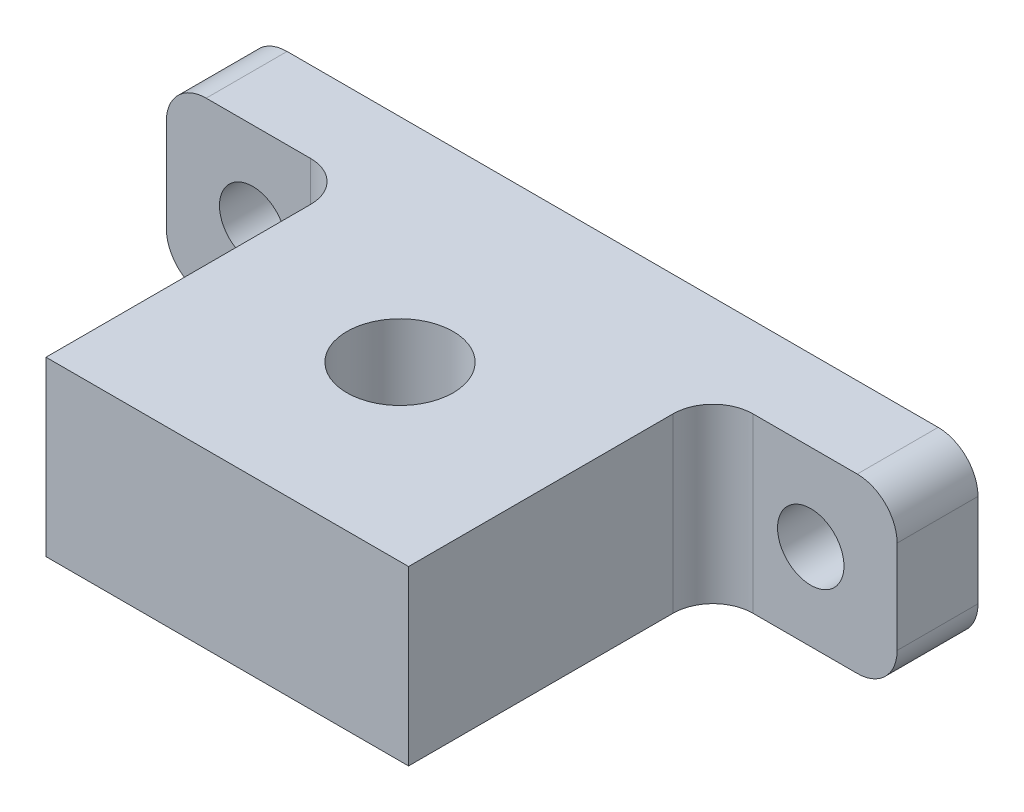
ISO-10303-21;
HEADER;
FILE_DESCRIPTION(('STEP AP214'),'2;1');
FILE_NAME('part.step','',(''),(''),'','','');
FILE_SCHEMA(('AUTOMOTIVE_DESIGN { 1 0 10303 214 1 1 1 1 }'));
ENDSEC;
DATA;
#1=APPLICATION_CONTEXT('core data for automotive mechanical design processes');
#2=APPLICATION_PROTOCOL_DEFINITION('international standard','automotive_design',2000,#1);
#3=PRODUCT_CONTEXT('',#1,'mechanical');
#4=PRODUCT('Part','Part','',(#3));
#5=PRODUCT_RELATED_PRODUCT_CATEGORY('part','',(#4));
#6=PRODUCT_DEFINITION_FORMATION('','',#4);
#7=PRODUCT_DEFINITION_CONTEXT('part definition',#1,'design');
#8=PRODUCT_DEFINITION('design','',#6,#7);
#9=PRODUCT_DEFINITION_SHAPE('','',#8);
#10=(LENGTH_UNIT() NAMED_UNIT(*) SI_UNIT(.MILLI.,.METRE.));
#11=(NAMED_UNIT(*) PLANE_ANGLE_UNIT() SI_UNIT($,.RADIAN.));
#12=(NAMED_UNIT(*) SI_UNIT($,.STERADIAN.) SOLID_ANGLE_UNIT());
#13=UNCERTAINTY_MEASURE_WITH_UNIT(LENGTH_MEASURE(1.E-05),#10,'distance_accuracy_value','');
#14=(GEOMETRIC_REPRESENTATION_CONTEXT(3) GLOBAL_UNCERTAINTY_ASSIGNED_CONTEXT((#13)) GLOBAL_UNIT_ASSIGNED_CONTEXT((#10,
#11,#12)) REPRESENTATION_CONTEXT('',''));
#15=CARTESIAN_POINT('',(0.,0.,0.));
#16=DIRECTION('',(0.,0.,1.));
#17=DIRECTION('',(1.,0.,0.));
#18=AXIS2_PLACEMENT_3D('',#15,#16,#17);
#19=CARTESIAN_POINT('',(24.5,3.5,29.));
#20=DIRECTION('',(0.,0.,-1.));
#21=DIRECTION('',(-1.,0.,0.));
#22=AXIS2_PLACEMENT_3D('',#19,#20,#21);
#23=PLANE('',#22);
#24=DIRECTION('',(-1.,0.,0.));
#25=VECTOR('',#24,1.);
#26=CARTESIAN_POINT('',(-24.5,6.5,29.));
#27=LINE('',#26,#25);
#28=CARTESIAN_POINT('',(13.643156347869,6.5,29.));
#29=VERTEX_POINT('',#28);
#30=CARTESIAN_POINT('',(-13.643156347869,6.5,29.));
#31=VERTEX_POINT('',#30);
#32=EDGE_CURVE('E219',#29,#31,#27,.T.);
#33=ORIENTED_EDGE('',*,*,#32,.T.);
#34=DIRECTION('',(0.,-1.,0.));
#35=VECTOR('',#34,1.);
#36=CARTESIAN_POINT('',(-13.643156347869,6.5,29.));
#37=LINE('',#36,#35);
#38=CARTESIAN_POINT('',(-13.643156347869,-6.5,29.));
#39=VERTEX_POINT('',#38);
#40=EDGE_CURVE('E169',#31,#39,#37,.T.);
#41=ORIENTED_EDGE('',*,*,#40,.T.);
#42=DIRECTION('',(1.,0.,0.));
#43=VECTOR('',#42,1.);
#44=CARTESIAN_POINT('',(-24.5,-6.5,29.));
#45=LINE('',#44,#43);
#46=CARTESIAN_POINT('',(13.643156347869,-6.5,29.));
#47=VERTEX_POINT('',#46);
#48=EDGE_CURVE('E222',#39,#47,#45,.T.);
#49=ORIENTED_EDGE('',*,*,#48,.T.);
#50=DIRECTION('',(0.,-1.,0.));
#51=VECTOR('',#50,1.);
#52=CARTESIAN_POINT('',(13.643156347869,6.5,29.));
#53=LINE('',#52,#51);
#54=EDGE_CURVE('E185',#29,#47,#53,.T.);
#55=ORIENTED_EDGE('',*,*,#54,.F.);
#56=EDGE_LOOP('',(#33,#41,#49,#55));
#57=FACE_BOUND('',#56,.T.);
#58=ADVANCED_FACE('F36',(#57),#23,.F.);
#59=CARTESIAN_POINT('',(24.5,3.5,0.));
#60=DIRECTION('',(0.,0.,-1.));
#61=DIRECTION('',(-1.,0.,0.));
#62=AXIS2_PLACEMENT_3D('',#59,#60,#61);
#63=PLANE('',#62);
#64=CARTESIAN_POINT('',(-21.,0.,0.));
#65=DIRECTION('',(0.,0.,1.));
#66=DIRECTION('',(1.,0.,0.));
#67=AXIS2_PLACEMENT_3D('',#64,#65,#66);
#68=CIRCLE('',#67,2.5);
#69=CARTESIAN_POINT('',(-23.5,0.,0.));
#70=VERTEX_POINT('',#69);
#71=EDGE_CURVE('E215',#70,#70,#68,.T.);
#72=ORIENTED_EDGE('',*,*,#71,.T.);
#73=EDGE_LOOP('',(#72));
#74=FACE_BOUND('',#73,.T.);
#75=CARTESIAN_POINT('',(24.5,3.5,0.));
#76=DIRECTION('',(0.,0.,1.));
#77=DIRECTION('',(-1.,0.,0.));
#78=AXIS2_PLACEMENT_3D('',#75,#76,#77);
#79=CIRCLE('',#78,3.);
#80=CARTESIAN_POINT('',(27.5,3.49999999999998,0.));
#81=VERTEX_POINT('',#80);
#82=CARTESIAN_POINT('',(24.5,6.5,0.));
#83=VERTEX_POINT('',#82);
#84=EDGE_CURVE('E218',#81,#83,#79,.T.);
#85=ORIENTED_EDGE('',*,*,#84,.F.);
#86=DIRECTION('',(0.,1.,0.));
#87=VECTOR('',#86,1.);
#88=CARTESIAN_POINT('',(27.5,-3.49999999999998,0.));
#89=LINE('',#88,#87);
#90=CARTESIAN_POINT('',(27.5,-3.5,0.));
#91=VERTEX_POINT('',#90);
#92=EDGE_CURVE('E223',#91,#81,#89,.T.);
#93=ORIENTED_EDGE('',*,*,#92,.F.);
#94=CARTESIAN_POINT('',(24.5,-3.5,0.));
#95=DIRECTION('',(0.,0.,1.));
#96=DIRECTION('',(1.,0.,0.));
#97=AXIS2_PLACEMENT_3D('',#94,#95,#96);
#98=CIRCLE('',#97,3.);
#99=CARTESIAN_POINT('',(24.5,-6.5,0.));
#100=VERTEX_POINT('',#99);
#101=EDGE_CURVE('E243',#100,#91,#98,.T.);
#102=ORIENTED_EDGE('',*,*,#101,.F.);
#103=DIRECTION('',(1.,0.,0.));
#104=VECTOR('',#103,1.);
#105=CARTESIAN_POINT('',(-24.5,-6.5,0.));
#106=LINE('',#105,#104);
#107=CARTESIAN_POINT('',(-24.5,-6.5,0.));
#108=VERTEX_POINT('',#107);
#109=EDGE_CURVE('E240',#108,#100,#106,.T.);
#110=ORIENTED_EDGE('',*,*,#109,.F.);
#111=CARTESIAN_POINT('',(-24.5,-3.5,0.));
#112=DIRECTION('',(0.,0.,1.));
#113=DIRECTION('',(-1.,0.,0.));
#114=AXIS2_PLACEMENT_3D('',#111,#112,#113);
#115=CIRCLE('',#114,3.);
#116=CARTESIAN_POINT('',(-27.5,-3.49999999999998,0.));
#117=VERTEX_POINT('',#116);
#118=EDGE_CURVE('E237',#117,#108,#115,.T.);
#119=ORIENTED_EDGE('',*,*,#118,.F.);
#120=DIRECTION('',(0.,-1.,0.));
#121=VECTOR('',#120,1.);
#122=CARTESIAN_POINT('',(-27.5,-3.49999999999998,0.));
#123=LINE('',#122,#121);
#124=CARTESIAN_POINT('',(-27.5,3.49999999999998,0.));
#125=VERTEX_POINT('',#124);
#126=EDGE_CURVE('E234',#125,#117,#123,.T.);
#127=ORIENTED_EDGE('',*,*,#126,.F.);
#128=CARTESIAN_POINT('',(-24.5,3.5,0.));
#129=DIRECTION('',(0.,0.,1.));
#130=DIRECTION('',(-1.,0.,0.));
#131=AXIS2_PLACEMENT_3D('',#128,#129,#130);
#132=CIRCLE('',#131,3.);
#133=CARTESIAN_POINT('',(-24.5,6.5,0.));
#134=VERTEX_POINT('',#133);
#135=EDGE_CURVE('E231',#134,#125,#132,.T.);
#136=ORIENTED_EDGE('',*,*,#135,.F.);
#137=DIRECTION('',(-1.,0.,0.));
#138=VECTOR('',#137,1.);
#139=CARTESIAN_POINT('',(-24.5,6.5,0.));
#140=LINE('',#139,#138);
#141=EDGE_CURVE('E229',#83,#134,#140,.T.);
#142=ORIENTED_EDGE('',*,*,#141,.F.);
#143=EDGE_LOOP('',(#85,#93,#102,#110,#119,#127,#136,#142));
#144=FACE_BOUND('',#143,.T.);
#145=CARTESIAN_POINT('',(21.,0.,0.));
#146=DIRECTION('',(0.,0.,1.));
#147=DIRECTION('',(-1.,0.,0.));
#148=AXIS2_PLACEMENT_3D('',#145,#146,#147);
#149=CIRCLE('',#148,2.5);
#150=CARTESIAN_POINT('',(18.5,0.,0.));
#151=VERTEX_POINT('',#150);
#152=EDGE_CURVE('E212',#151,#151,#149,.T.);
#153=ORIENTED_EDGE('',*,*,#152,.T.);
#154=EDGE_LOOP('',(#153));
#155=FACE_BOUND('',#154,.T.);
#156=ADVANCED_FACE('F271',(#74,#144,#155),#63,.T.);
#157=CARTESIAN_POINT('',(24.5,3.5,29.));
#158=DIRECTION('',(0.,0.,-1.));
#159=DIRECTION('',(-1.,0.,0.));
#160=AXIS2_PLACEMENT_3D('',#157,#158,#159);
#161=CYLINDRICAL_SURFACE('',#160,3.);
#162=DIRECTION('',(0.,0.,-1.));
#163=VECTOR('',#162,1.);
#164=CARTESIAN_POINT('',(24.5,6.5,29.));
#165=LINE('',#164,#163);
#166=CARTESIAN_POINT('',(24.5,6.5,6.08705538521432));
#167=VERTEX_POINT('',#166);
#168=EDGE_CURVE('E11',#167,#83,#165,.T.);
#169=ORIENTED_EDGE('',*,*,#168,.F.);
#170=CARTESIAN_POINT('',(24.5,3.5,6.08705538521432));
#171=DIRECTION('',(0.,0.,-1.));
#172=DIRECTION('',(-1.,0.,0.));
#173=AXIS2_PLACEMENT_3D('',#170,#171,#172);
#174=CIRCLE('',#173,3.);
#175=CARTESIAN_POINT('',(27.5,3.49999999999998,6.08705538521432));
#176=VERTEX_POINT('',#175);
#177=EDGE_CURVE('E206',#167,#176,#174,.T.);
#178=ORIENTED_EDGE('',*,*,#177,.T.);
#179=DIRECTION('',(0.,0.,-1.));
#180=VECTOR('',#179,1.);
#181=CARTESIAN_POINT('',(27.5,3.49999999999998,29.));
#182=LINE('',#181,#180);
#183=EDGE_CURVE('E226',#176,#81,#182,.T.);
#184=ORIENTED_EDGE('',*,*,#183,.T.);
#185=ORIENTED_EDGE('',*,*,#84,.T.);
#186=EDGE_LOOP('',(#169,#178,#184,#185));
#187=FACE_BOUND('',#186,.T.);
#188=ADVANCED_FACE('F38',(#187),#161,.T.);
#189=CARTESIAN_POINT('',(-24.5,6.5,29.));
#190=DIRECTION('',(0.,-1.,0.));
#191=DIRECTION('',(1.,0.,0.));
#192=AXIS2_PLACEMENT_3D('',#189,#190,#191);
#193=PLANE('',#192);
#194=CARTESIAN_POINT('',(0.,6.5,16.));
#195=DIRECTION('',(0.,-1.,0.));
#196=DIRECTION('',(1.,0.,0.));
#197=AXIS2_PLACEMENT_3D('',#194,#195,#196);
#198=CIRCLE('',#197,4.);
#199=CARTESIAN_POINT('',(4.,6.5,16.));
#200=VERTEX_POINT('',#199);
#201=EDGE_CURVE('E190',#200,#200,#198,.T.);
#202=ORIENTED_EDGE('',*,*,#201,.T.);
#203=EDGE_LOOP('',(#202));
#204=FACE_BOUND('',#203,.T.);
#205=CARTESIAN_POINT('',(-16.643156347869,6.5,9.08705538521433));
#206=DIRECTION('',(0.,-1.,0.));
#207=DIRECTION('',(1.,0.,0.));
#208=AXIS2_PLACEMENT_3D('',#205,#206,#207);
#209=CIRCLE('',#208,3.);
#210=CARTESIAN_POINT('',(-16.643156347869,6.5,6.08705538521433));
#211=VERTEX_POINT('',#210);
#212=CARTESIAN_POINT('',(-13.643156347869,6.5,9.08705538521435));
#213=VERTEX_POINT('',#212);
#214=EDGE_CURVE('E150',#211,#213,#209,.T.);
#215=ORIENTED_EDGE('',*,*,#214,.T.);
#216=DIRECTION('',(0.,0.,1.));
#217=VECTOR('',#216,1.);
#218=CARTESIAN_POINT('',(-13.643156347869,6.5,29.));
#219=LINE('',#218,#217);
#220=EDGE_CURVE('E155',#213,#31,#219,.T.);
#221=ORIENTED_EDGE('',*,*,#220,.T.);
#222=ORIENTED_EDGE('',*,*,#32,.F.);
#223=DIRECTION('',(0.,0.,-1.));
#224=VECTOR('',#223,1.);
#225=CARTESIAN_POINT('',(13.643156347869,6.5,29.));
#226=LINE('',#225,#224);
#227=CARTESIAN_POINT('',(13.643156347869,6.5,9.08705538521432));
#228=VERTEX_POINT('',#227);
#229=EDGE_CURVE('E175',#29,#228,#226,.T.);
#230=ORIENTED_EDGE('',*,*,#229,.T.);
#231=CARTESIAN_POINT('',(16.643156347869,6.5,9.08705538521432));
#232=DIRECTION('',(0.,-1.,0.));
#233=DIRECTION('',(-1.,0.,0.));
#234=AXIS2_PLACEMENT_3D('',#231,#232,#233);
#235=CIRCLE('',#234,3.);
#236=CARTESIAN_POINT('',(16.643156347869,6.5,6.08705538521432));
#237=VERTEX_POINT('',#236);
#238=EDGE_CURVE('E178',#228,#237,#235,.T.);
#239=ORIENTED_EDGE('',*,*,#238,.T.);
#240=DIRECTION('',(1.,0.,0.));
#241=VECTOR('',#240,1.);
#242=CARTESIAN_POINT('',(27.5,6.5,6.08705538521432));
#243=LINE('',#242,#241);
#244=EDGE_CURVE('E182',#237,#167,#243,.T.);
#245=ORIENTED_EDGE('',*,*,#244,.T.);
#246=ORIENTED_EDGE('',*,*,#168,.T.);
#247=ORIENTED_EDGE('',*,*,#141,.T.);
#248=DIRECTION('',(0.,0.,-1.));
#249=VECTOR('',#248,1.);
#250=CARTESIAN_POINT('',(-24.5,6.5,29.));
#251=LINE('',#250,#249);
#252=CARTESIAN_POINT('',(-24.5,6.5,6.08705538521433));
#253=VERTEX_POINT('',#252);
#254=EDGE_CURVE('E45',#253,#134,#251,.T.);
#255=ORIENTED_EDGE('',*,*,#254,.F.);
#256=DIRECTION('',(1.,0.,0.));
#257=VECTOR('',#256,1.);
#258=CARTESIAN_POINT('',(-27.5,6.5,6.08705538521433));
#259=LINE('',#258,#257);
#260=EDGE_CURVE('E140',#253,#211,#259,.T.);
#261=ORIENTED_EDGE('',*,*,#260,.T.);
#262=EDGE_LOOP('',(#215,#221,#222,#230,#239,#245,#246,#247,#255,#261));
#263=FACE_BOUND('',#262,.T.);
#264=ADVANCED_FACE('F158',(#204,#263),#193,.F.);
#265=CARTESIAN_POINT('',(-24.5,3.5,29.));
#266=DIRECTION('',(0.,0.,-1.));
#267=DIRECTION('',(-1.,0.,0.));
#268=AXIS2_PLACEMENT_3D('',#265,#266,#267);
#269=CYLINDRICAL_SURFACE('',#268,3.);
#270=DIRECTION('',(0.,0.,-1.));
#271=VECTOR('',#270,1.);
#272=CARTESIAN_POINT('',(-27.5,3.49999999999998,29.));
#273=LINE('',#272,#271);
#274=CARTESIAN_POINT('',(-27.5,3.49999999999998,6.08705538521433));
#275=VERTEX_POINT('',#274);
#276=EDGE_CURVE('E257',#275,#125,#273,.T.);
#277=ORIENTED_EDGE('',*,*,#276,.F.);
#278=CARTESIAN_POINT('',(-24.5,3.5,6.08705538521433));
#279=DIRECTION('',(0.,0.,-1.));
#280=DIRECTION('',(-1.,0.,0.));
#281=AXIS2_PLACEMENT_3D('',#278,#279,#280);
#282=CIRCLE('',#281,3.);
#283=EDGE_CURVE('E210',#275,#253,#282,.T.);
#284=ORIENTED_EDGE('',*,*,#283,.T.);
#285=ORIENTED_EDGE('',*,*,#254,.T.);
#286=ORIENTED_EDGE('',*,*,#135,.T.);
#287=EDGE_LOOP('',(#277,#284,#285,#286));
#288=FACE_BOUND('',#287,.T.);
#289=ADVANCED_FACE('F304',(#288),#269,.T.);
#290=CARTESIAN_POINT('',(-27.5,-3.49999999999998,29.));
#291=DIRECTION('',(1.,0.,0.));
#292=DIRECTION('',(0.,0.,-1.));
#293=AXIS2_PLACEMENT_3D('',#290,#291,#292);
#294=PLANE('',#293);
#295=DIRECTION('',(0.,0.,-1.));
#296=VECTOR('',#295,1.);
#297=CARTESIAN_POINT('',(-27.5,-3.49999999999998,29.));
#298=LINE('',#297,#296);
#299=CARTESIAN_POINT('',(-27.5,-3.5,6.08705538521433));
#300=VERTEX_POINT('',#299);
#301=EDGE_CURVE('E255',#300,#117,#298,.T.);
#302=ORIENTED_EDGE('',*,*,#301,.F.);
#303=DIRECTION('',(0.,-1.,0.));
#304=VECTOR('',#303,1.);
#305=CARTESIAN_POINT('',(-27.5,6.5,6.08705538521433));
#306=LINE('',#305,#304);
#307=EDGE_CURVE('E147',#275,#300,#306,.T.);
#308=ORIENTED_EDGE('',*,*,#307,.F.);
#309=ORIENTED_EDGE('',*,*,#276,.T.);
#310=ORIENTED_EDGE('',*,*,#126,.T.);
#311=EDGE_LOOP('',(#302,#308,#309,#310));
#312=FACE_BOUND('',#311,.T.);
#313=ADVANCED_FACE('F300',(#312),#294,.F.);
#314=CARTESIAN_POINT('',(-24.5,-3.5,29.));
#315=DIRECTION('',(0.,0.,-1.));
#316=DIRECTION('',(-1.,0.,0.));
#317=AXIS2_PLACEMENT_3D('',#314,#315,#316);
#318=CYLINDRICAL_SURFACE('',#317,3.);
#319=DIRECTION('',(0.,0.,-1.));
#320=VECTOR('',#319,1.);
#321=CARTESIAN_POINT('',(-24.5,-6.5,29.));
#322=LINE('',#321,#320);
#323=CARTESIAN_POINT('',(-24.5,-6.5,6.08705538521433));
#324=VERTEX_POINT('',#323);
#325=EDGE_CURVE('E253',#324,#108,#322,.T.);
#326=ORIENTED_EDGE('',*,*,#325,.F.);
#327=CARTESIAN_POINT('',(-24.5,-3.5,6.08705538521433));
#328=DIRECTION('',(0.,0.,-1.));
#329=DIRECTION('',(-1.,0.,0.));
#330=AXIS2_PLACEMENT_3D('',#327,#328,#329);
#331=CIRCLE('',#330,3.);
#332=EDGE_CURVE('E53',#324,#300,#331,.T.);
#333=ORIENTED_EDGE('',*,*,#332,.T.);
#334=ORIENTED_EDGE('',*,*,#301,.T.);
#335=ORIENTED_EDGE('',*,*,#118,.T.);
#336=EDGE_LOOP('',(#326,#333,#334,#335));
#337=FACE_BOUND('',#336,.T.);
#338=ADVANCED_FACE('F296',(#337),#318,.T.);
#339=CARTESIAN_POINT('',(-24.5,-6.5,29.));
#340=DIRECTION('',(0.,1.,0.));
#341=DIRECTION('',(-1.,0.,0.));
#342=AXIS2_PLACEMENT_3D('',#339,#340,#341);
#343=PLANE('',#342);
#344=CARTESIAN_POINT('',(0.,-6.5,16.));
#345=DIRECTION('',(0.,-1.,0.));
#346=DIRECTION('',(1.,0.,0.));
#347=AXIS2_PLACEMENT_3D('',#344,#345,#346);
#348=CIRCLE('',#347,4.);
#349=CARTESIAN_POINT('',(4.,-6.5,16.));
#350=VERTEX_POINT('',#349);
#351=EDGE_CURVE('E202',#350,#350,#348,.T.);
#352=ORIENTED_EDGE('',*,*,#351,.F.);
#353=EDGE_LOOP('',(#352));
#354=FACE_BOUND('',#353,.T.);
#355=ORIENTED_EDGE('',*,*,#48,.F.);
#356=DIRECTION('',(0.,0.,1.));
#357=VECTOR('',#356,1.);
#358=CARTESIAN_POINT('',(-13.643156347869,-6.5,29.));
#359=LINE('',#358,#357);
#360=CARTESIAN_POINT('',(-13.643156347869,-6.5,9.08705538521435));
#361=VERTEX_POINT('',#360);
#362=EDGE_CURVE('E160',#361,#39,#359,.T.);
#363=ORIENTED_EDGE('',*,*,#362,.F.);
#364=CARTESIAN_POINT('',(-16.643156347869,-6.5,9.08705538521433));
#365=DIRECTION('',(0.,-1.,0.));
#366=DIRECTION('',(1.,0.,0.));
#367=AXIS2_PLACEMENT_3D('',#364,#365,#366);
#368=CIRCLE('',#367,3.);
#369=CARTESIAN_POINT('',(-16.643156347869,-6.5,6.08705538521433));
#370=VERTEX_POINT('',#369);
#371=EDGE_CURVE('E162',#370,#361,#368,.T.);
#372=ORIENTED_EDGE('',*,*,#371,.F.);
#373=DIRECTION('',(1.,0.,0.));
#374=VECTOR('',#373,1.);
#375=CARTESIAN_POINT('',(-27.5,-6.5,6.08705538521433));
#376=LINE('',#375,#374);
#377=EDGE_CURVE('E142',#324,#370,#376,.T.);
#378=ORIENTED_EDGE('',*,*,#377,.F.);
#379=ORIENTED_EDGE('',*,*,#325,.T.);
#380=ORIENTED_EDGE('',*,*,#109,.T.);
#381=DIRECTION('',(0.,0.,-1.));
#382=VECTOR('',#381,1.);
#383=CARTESIAN_POINT('',(24.5,-6.5,29.));
#384=LINE('',#383,#382);
#385=CARTESIAN_POINT('',(24.5,-6.5,6.08705538521432));
#386=VERTEX_POINT('',#385);
#387=EDGE_CURVE('E251',#386,#100,#384,.T.);
#388=ORIENTED_EDGE('',*,*,#387,.F.);
#389=DIRECTION('',(1.,0.,0.));
#390=VECTOR('',#389,1.);
#391=CARTESIAN_POINT('',(27.5,-6.5,6.08705538521432));
#392=LINE('',#391,#390);
#393=CARTESIAN_POINT('',(16.643156347869,-6.5,6.08705538521432));
#394=VERTEX_POINT('',#393);
#395=EDGE_CURVE('E179',#394,#386,#392,.T.);
#396=ORIENTED_EDGE('',*,*,#395,.F.);
#397=CARTESIAN_POINT('',(16.643156347869,-6.5,9.08705538521432));
#398=DIRECTION('',(0.,-1.,0.));
#399=DIRECTION('',(-1.,0.,0.));
#400=AXIS2_PLACEMENT_3D('',#397,#398,#399);
#401=CIRCLE('',#400,3.);
#402=CARTESIAN_POINT('',(13.643156347869,-6.5,9.08705538521432));
#403=VERTEX_POINT('',#402);
#404=EDGE_CURVE('E189',#403,#394,#401,.T.);
#405=ORIENTED_EDGE('',*,*,#404,.F.);
#406=DIRECTION('',(0.,0.,-1.));
#407=VECTOR('',#406,1.);
#408=CARTESIAN_POINT('',(13.643156347869,-6.5,29.));
#409=LINE('',#408,#407);
#410=EDGE_CURVE('E186',#47,#403,#409,.T.);
#411=ORIENTED_EDGE('',*,*,#410,.F.);
#412=EDGE_LOOP('',(#355,#363,#372,#378,#379,#380,#388,#396,#405,#411));
#413=FACE_BOUND('',#412,.T.);
#414=ADVANCED_FACE('F292',(#354,#413),#343,.F.);
#415=CARTESIAN_POINT('',(24.5,-3.5,29.));
#416=DIRECTION('',(0.,0.,-1.));
#417=DIRECTION('',(-1.,0.,0.));
#418=AXIS2_PLACEMENT_3D('',#415,#416,#417);
#419=CYLINDRICAL_SURFACE('',#418,3.);
#420=DIRECTION('',(0.,0.,-1.));
#421=VECTOR('',#420,1.);
#422=CARTESIAN_POINT('',(27.5,-3.5,29.));
#423=LINE('',#422,#421);
#424=CARTESIAN_POINT('',(27.5,-3.5,6.08705538521433));
#425=VERTEX_POINT('',#424);
#426=EDGE_CURVE('E249',#425,#91,#423,.T.);
#427=ORIENTED_EDGE('',*,*,#426,.F.);
#428=CARTESIAN_POINT('',(24.5,-3.5,6.08705538521432));
#429=DIRECTION('',(0.,0.,-1.));
#430=DIRECTION('',(-1.,0.,0.));
#431=AXIS2_PLACEMENT_3D('',#428,#429,#430);
#432=CIRCLE('',#431,3.);
#433=EDGE_CURVE('E61',#425,#386,#432,.T.);
#434=ORIENTED_EDGE('',*,*,#433,.T.);
#435=ORIENTED_EDGE('',*,*,#387,.T.);
#436=ORIENTED_EDGE('',*,*,#101,.T.);
#437=EDGE_LOOP('',(#427,#434,#435,#436));
#438=FACE_BOUND('',#437,.T.);
#439=ADVANCED_FACE('F288',(#438),#419,.T.);
#440=CARTESIAN_POINT('',(27.5,-3.49999999999998,29.));
#441=DIRECTION('',(-1.,0.,0.));
#442=DIRECTION('',(0.,0.,1.));
#443=AXIS2_PLACEMENT_3D('',#440,#441,#442);
#444=PLANE('',#443);
#445=ORIENTED_EDGE('',*,*,#183,.F.);
#446=DIRECTION('',(0.,-1.,0.));
#447=VECTOR('',#446,1.);
#448=CARTESIAN_POINT('',(27.5,6.5,6.08705538521432));
#449=LINE('',#448,#447);
#450=EDGE_CURVE('E167',#176,#425,#449,.T.);
#451=ORIENTED_EDGE('',*,*,#450,.T.);
#452=ORIENTED_EDGE('',*,*,#426,.T.);
#453=ORIENTED_EDGE('',*,*,#92,.T.);
#454=EDGE_LOOP('',(#445,#451,#452,#453));
#455=FACE_BOUND('',#454,.T.);
#456=ADVANCED_FACE('F285',(#455),#444,.F.);
#457=CARTESIAN_POINT('',(-21.,0.,29.));
#458=DIRECTION('',(0.,0.,-1.));
#459=DIRECTION('',(-1.,0.,0.));
#460=AXIS2_PLACEMENT_3D('',#457,#458,#459);
#461=CYLINDRICAL_SURFACE('',#460,2.5);
#462=CARTESIAN_POINT('',(-21.,0.,6.08705538521433));
#463=DIRECTION('',(0.,0.,-1.));
#464=DIRECTION('',(-1.,0.,0.));
#465=AXIS2_PLACEMENT_3D('',#462,#463,#464);
#466=CIRCLE('',#465,2.5);
#467=CARTESIAN_POINT('',(-23.5,0.,6.08705538521433));
#468=VERTEX_POINT('',#467);
#469=EDGE_CURVE('E40',#468,#468,#466,.T.);
#470=CARTESIAN_POINT('',(-23.5,0.,6.08705538521433));
#471=CARTESIAN_POINT('',(-23.5,0.,6.02364855828501));
#472=CARTESIAN_POINT('',(-23.5,0.,5.96024173135569));
#473=CARTESIAN_POINT('',(-23.5,0.,5.83342807749706));
#474=CARTESIAN_POINT('',(-23.5,0.,5.77002125056775));
#475=CARTESIAN_POINT('',(-23.5,0.,5.64320759670912));
#476=CARTESIAN_POINT('',(-23.5,0.,5.5798007697798));
#477=CARTESIAN_POINT('',(-23.5,0.,5.45298711592117));
#478=CARTESIAN_POINT('',(-23.5,0.,5.38958028899185));
#479=CARTESIAN_POINT('',(-23.5,0.,5.26276663513322));
#480=CARTESIAN_POINT('',(-23.5,0.,5.1993598082039));
#481=CARTESIAN_POINT('',(-23.5,0.,5.07254615434527));
#482=CARTESIAN_POINT('',(-23.5,0.,5.00913932741596));
#483=CARTESIAN_POINT('',(-23.5,0.,4.88232567355732));
#484=CARTESIAN_POINT('',(-23.5,0.,4.81891884662801));
#485=CARTESIAN_POINT('',(-23.5,0.,4.69210519276938));
#486=CARTESIAN_POINT('',(-23.5,0.,4.62869836584006));
#487=CARTESIAN_POINT('',(-23.5,0.,4.50188471198143));
#488=CARTESIAN_POINT('',(-23.5,0.,4.43847788505211));
#489=CARTESIAN_POINT('',(-23.5,0.,4.31166423119348));
#490=CARTESIAN_POINT('',(-23.5,0.,4.24825740426417));
#491=CARTESIAN_POINT('',(-23.5,0.,4.12144375040553));
#492=CARTESIAN_POINT('',(-23.5,0.,4.05803692347622));
#493=CARTESIAN_POINT('',(-23.5,0.,3.93122326961759));
#494=CARTESIAN_POINT('',(-23.5,0.,3.86781644268827));
#495=CARTESIAN_POINT('',(-23.5,0.,3.74100278882964));
#496=CARTESIAN_POINT('',(-23.5,0.,3.67759596190032));
#497=CARTESIAN_POINT('',(-23.5,0.,3.55078230804169));
#498=CARTESIAN_POINT('',(-23.5,0.,3.48737548111237));
#499=CARTESIAN_POINT('',(-23.5,0.,3.36056182725374));
#500=CARTESIAN_POINT('',(-23.5,0.,3.29715500032443));
#501=CARTESIAN_POINT('',(-23.5,0.,3.1703413464658));
#502=CARTESIAN_POINT('',(-23.5,0.,3.10693451953648));
#503=CARTESIAN_POINT('',(-23.5,0.,2.98012086567785));
#504=CARTESIAN_POINT('',(-23.5,0.,2.91671403874853));
#505=CARTESIAN_POINT('',(-23.5,0.,2.7899003848899));
#506=CARTESIAN_POINT('',(-23.5,0.,2.72649355796058));
#507=CARTESIAN_POINT('',(-23.5,0.,2.59967990410195));
#508=CARTESIAN_POINT('',(-23.5,0.,2.53627307717264));
#509=CARTESIAN_POINT('',(-23.5,0.,2.409459423314));
#510=CARTESIAN_POINT('',(-23.5,0.,2.34605259638469));
#511=CARTESIAN_POINT('',(-23.5,0.,2.21923894252606));
#512=CARTESIAN_POINT('',(-23.5,0.,2.15583211559674));
#513=CARTESIAN_POINT('',(-23.5,0.,2.02901846173811));
#514=CARTESIAN_POINT('',(-23.5,0.,1.96561163480879));
#515=CARTESIAN_POINT('',(-23.5,0.,1.83879798095016));
#516=CARTESIAN_POINT('',(-23.5,0.,1.77539115402084));
#517=CARTESIAN_POINT('',(-23.5,0.,1.64857750016221));
#518=CARTESIAN_POINT('',(-23.5,0.,1.5851706732329));
#519=CARTESIAN_POINT('',(-23.5,0.,1.45835701937427));
#520=CARTESIAN_POINT('',(-23.5,0.,1.39495019244495));
#521=CARTESIAN_POINT('',(-23.5,0.,1.26813653858632));
#522=CARTESIAN_POINT('',(-23.5,0.,1.204729711657));
#523=CARTESIAN_POINT('',(-23.5,0.,1.07791605779837));
#524=CARTESIAN_POINT('',(-23.5,0.,1.01450923086905));
#525=CARTESIAN_POINT('',(-23.5,0.,0.887695577010422));
#526=CARTESIAN_POINT('',(-23.5,0.,0.824288750081105));
#527=CARTESIAN_POINT('',(-23.5,0.,0.697475096222474));
#528=CARTESIAN_POINT('',(-23.5,0.,0.634068269293159));
#529=CARTESIAN_POINT('',(-23.5,0.,0.507254615434527));
#530=CARTESIAN_POINT('',(-23.5,0.,0.443847788505211));
#531=CARTESIAN_POINT('',(-23.5,0.,0.317034134646579));
#532=CARTESIAN_POINT('',(-23.5,0.,0.253627307717264));
#533=CARTESIAN_POINT('',(-23.5,0.,0.126813653858633));
#534=CARTESIAN_POINT('',(-23.5,0.,0.0634068269293163));
#535=CARTESIAN_POINT('',(-23.5,0.,0.));
#536=B_SPLINE_CURVE_WITH_KNOTS('',3,(#470,#471,#472,#473,#474,#475,#476,#477,#478,#479,#480,
#481,#482,#483,#484,#485,#486,#487,#488,#489,#490,#491,#492,#493,#494,#495,#496,#497,#498,#499,
#500,#501,#502,#503,#504,#505,#506,#507,#508,#509,#510,#511,#512,#513,#514,#515,#516,#517,#518,
#519,#520,#521,#522,#523,#524,#525,#526,#527,#528,#529,#530,#531,#532,#533,#534,#535),
.UNSPECIFIED.,.F.,.F.,(4,2,2,2,2,2,2,2,2,2,2,2,2,2,2,2,2,2,2,2,2,2,2,2,2,2,2,2,2,2,2,2,4),(0.,
0.190220480787949,0.380440961575895,0.570661442363844,0.760881923151789,0.951102403939738,
1.14132288472769,1.33154336551563,1.52176384630358,1.71198432709153,1.90220480787948,
2.09242528866743,2.28264576945537,2.47286625024332,2.66308673103127,2.85330721181921,
3.04352769260716,3.23374817339511,3.42396865418306,3.61418913497101,3.80440961575895,
3.9946300965469,4.18485057733485,4.3750710581228,4.56529153891074,4.75551201969869,
4.94573250048664,5.13595298127459,5.32617346206254,5.51639394285048,5.70661442363843,
5.89683490442638,6.08705538521433),.UNSPECIFIED.);
#537=EDGE_CURVE('BSEAM267',#468,#70,#536,.T.);
#538=ORIENTED_EDGE('',*,*,#469,.F.);
#539=ORIENTED_EDGE('',*,*,#71,.F.);
#540=ORIENTED_EDGE('',*,*,#537,.T.);
#541=ORIENTED_EDGE('',*,*,#537,.F.);
#542=EDGE_LOOP('',(#538,#540,#539,#541));
#543=FACE_BOUND('',#542,.T.);
#544=ADVANCED_FACE('F267',(#543),#461,.F.);
#545=CARTESIAN_POINT('',(21.,0.,29.));
#546=DIRECTION('',(0.,0.,-1.));
#547=DIRECTION('',(-1.,0.,0.));
#548=AXIS2_PLACEMENT_3D('',#545,#546,#547);
#549=CYLINDRICAL_SURFACE('',#548,2.5);
#550=CARTESIAN_POINT('',(21.,0.,6.08705538521432));
#551=DIRECTION('',(0.,0.,-1.));
#552=DIRECTION('',(-1.,0.,0.));
#553=AXIS2_PLACEMENT_3D('',#550,#551,#552);
#554=CIRCLE('',#553,2.5);
#555=CARTESIAN_POINT('',(18.5,0.,6.08705538521433));
#556=VERTEX_POINT('',#555);
#557=EDGE_CURVE('E172',#556,#556,#554,.T.);
#558=CARTESIAN_POINT('',(18.5,0.,6.08705538521433));
#559=CARTESIAN_POINT('',(18.5,0.,6.02364855828501));
#560=CARTESIAN_POINT('',(18.5,0.,5.96024173135569));
#561=CARTESIAN_POINT('',(18.5,0.,5.83342807749706));
#562=CARTESIAN_POINT('',(18.5,0.,5.77002125056775));
#563=CARTESIAN_POINT('',(18.5,0.,5.64320759670912));
#564=CARTESIAN_POINT('',(18.5,0.,5.5798007697798));
#565=CARTESIAN_POINT('',(18.5,0.,5.45298711592117));
#566=CARTESIAN_POINT('',(18.5,0.,5.38958028899185));
#567=CARTESIAN_POINT('',(18.5,0.,5.26276663513322));
#568=CARTESIAN_POINT('',(18.5,0.,5.1993598082039));
#569=CARTESIAN_POINT('',(18.5,0.,5.07254615434527));
#570=CARTESIAN_POINT('',(18.5,0.,5.00913932741596));
#571=CARTESIAN_POINT('',(18.5,0.,4.88232567355732));
#572=CARTESIAN_POINT('',(18.5,0.,4.81891884662801));
#573=CARTESIAN_POINT('',(18.5,0.,4.69210519276938));
#574=CARTESIAN_POINT('',(18.5,0.,4.62869836584006));
#575=CARTESIAN_POINT('',(18.5,0.,4.50188471198143));
#576=CARTESIAN_POINT('',(18.5,0.,4.43847788505211));
#577=CARTESIAN_POINT('',(18.5,0.,4.31166423119348));
#578=CARTESIAN_POINT('',(18.5,0.,4.24825740426417));
#579=CARTESIAN_POINT('',(18.5,0.,4.12144375040553));
#580=CARTESIAN_POINT('',(18.5,0.,4.05803692347622));
#581=CARTESIAN_POINT('',(18.5,0.,3.93122326961759));
#582=CARTESIAN_POINT('',(18.5,0.,3.86781644268827));
#583=CARTESIAN_POINT('',(18.5,0.,3.74100278882964));
#584=CARTESIAN_POINT('',(18.5,0.,3.67759596190032));
#585=CARTESIAN_POINT('',(18.5,0.,3.55078230804169));
#586=CARTESIAN_POINT('',(18.5,0.,3.48737548111237));
#587=CARTESIAN_POINT('',(18.5,0.,3.36056182725374));
#588=CARTESIAN_POINT('',(18.5,0.,3.29715500032443));
#589=CARTESIAN_POINT('',(18.5,0.,3.1703413464658));
#590=CARTESIAN_POINT('',(18.5,0.,3.10693451953648));
#591=CARTESIAN_POINT('',(18.5,0.,2.98012086567785));
#592=CARTESIAN_POINT('',(18.5,0.,2.91671403874853));
#593=CARTESIAN_POINT('',(18.5,0.,2.7899003848899));
#594=CARTESIAN_POINT('',(18.5,0.,2.72649355796058));
#595=CARTESIAN_POINT('',(18.5,0.,2.59967990410195));
#596=CARTESIAN_POINT('',(18.5,0.,2.53627307717264));
#597=CARTESIAN_POINT('',(18.5,0.,2.409459423314));
#598=CARTESIAN_POINT('',(18.5,0.,2.34605259638469));
#599=CARTESIAN_POINT('',(18.5,0.,2.21923894252606));
#600=CARTESIAN_POINT('',(18.5,0.,2.15583211559674));
#601=CARTESIAN_POINT('',(18.5,0.,2.02901846173811));
#602=CARTESIAN_POINT('',(18.5,0.,1.96561163480879));
#603=CARTESIAN_POINT('',(18.5,0.,1.83879798095016));
#604=CARTESIAN_POINT('',(18.5,0.,1.77539115402084));
#605=CARTESIAN_POINT('',(18.5,0.,1.64857750016221));
#606=CARTESIAN_POINT('',(18.5,0.,1.5851706732329));
#607=CARTESIAN_POINT('',(18.5,0.,1.45835701937427));
#608=CARTESIAN_POINT('',(18.5,0.,1.39495019244495));
#609=CARTESIAN_POINT('',(18.5,0.,1.26813653858632));
#610=CARTESIAN_POINT('',(18.5,0.,1.204729711657));
#611=CARTESIAN_POINT('',(18.5,0.,1.07791605779837));
#612=CARTESIAN_POINT('',(18.5,0.,1.01450923086905));
#613=CARTESIAN_POINT('',(18.5,0.,0.887695577010422));
#614=CARTESIAN_POINT('',(18.5,0.,0.824288750081105));
#615=CARTESIAN_POINT('',(18.5,0.,0.697475096222474));
#616=CARTESIAN_POINT('',(18.5,0.,0.634068269293159));
#617=CARTESIAN_POINT('',(18.5,0.,0.507254615434527));
#618=CARTESIAN_POINT('',(18.5,0.,0.443847788505211));
#619=CARTESIAN_POINT('',(18.5,0.,0.317034134646579));
#620=CARTESIAN_POINT('',(18.5,0.,0.253627307717264));
#621=CARTESIAN_POINT('',(18.5,0.,0.126813653858633));
#622=CARTESIAN_POINT('',(18.5,0.,0.0634068269293163));
#623=CARTESIAN_POINT('',(18.5,0.,0.));
#624=B_SPLINE_CURVE_WITH_KNOTS('',3,(#558,#559,#560,#561,#562,#563,#564,#565,#566,#567,#568,
#569,#570,#571,#572,#573,#574,#575,#576,#577,#578,#579,#580,#581,#582,#583,#584,#585,#586,#587,
#588,#589,#590,#591,#592,#593,#594,#595,#596,#597,#598,#599,#600,#601,#602,#603,#604,#605,#606,
#607,#608,#609,#610,#611,#612,#613,#614,#615,#616,#617,#618,#619,#620,#621,#622,#623),
.UNSPECIFIED.,.F.,.F.,(4,2,2,2,2,2,2,2,2,2,2,2,2,2,2,2,2,2,2,2,2,2,2,2,2,2,2,2,2,2,2,2,4),(0.,
0.190220480787949,0.380440961575895,0.570661442363844,0.760881923151789,0.951102403939738,
1.14132288472769,1.33154336551563,1.52176384630358,1.71198432709153,1.90220480787948,
2.09242528866743,2.28264576945537,2.47286625024332,2.66308673103127,2.85330721181921,
3.04352769260716,3.23374817339511,3.42396865418306,3.61418913497101,3.80440961575895,
3.9946300965469,4.18485057733485,4.3750710581228,4.56529153891074,4.75551201969869,
4.94573250048664,5.13595298127459,5.32617346206254,5.51639394285048,5.70661442363843,
5.89683490442638,6.08705538521433),.UNSPECIFIED.);
#625=EDGE_CURVE('BSEAM264',#556,#151,#624,.T.);
#626=ORIENTED_EDGE('',*,*,#557,.F.);
#627=ORIENTED_EDGE('',*,*,#152,.F.);
#628=ORIENTED_EDGE('',*,*,#625,.T.);
#629=ORIENTED_EDGE('',*,*,#625,.F.);
#630=EDGE_LOOP('',(#626,#628,#627,#629));
#631=FACE_BOUND('',#630,.T.);
#632=ADVANCED_FACE('F264',(#631),#549,.F.);
#633=CARTESIAN_POINT('',(27.5,6.5,6.08705538521432));
#634=DIRECTION('',(0.,0.,-1.));
#635=DIRECTION('',(-1.,0.,0.));
#636=AXIS2_PLACEMENT_3D('',#633,#634,#635);
#637=PLANE('',#636);
#638=ORIENTED_EDGE('',*,*,#557,.T.);
#639=EDGE_LOOP('',(#638));
#640=FACE_BOUND('',#639,.T.);
#641=ORIENTED_EDGE('',*,*,#244,.F.);
#642=DIRECTION('',(0.,-1.,0.));
#643=VECTOR('',#642,1.);
#644=CARTESIAN_POINT('',(16.643156347869,6.5,6.08705538521432));
#645=LINE('',#644,#643);
#646=EDGE_CURVE('E195',#237,#394,#645,.T.);
#647=ORIENTED_EDGE('',*,*,#646,.T.);
#648=ORIENTED_EDGE('',*,*,#395,.T.);
#649=ORIENTED_EDGE('',*,*,#433,.F.);
#650=ORIENTED_EDGE('',*,*,#450,.F.);
#651=ORIENTED_EDGE('',*,*,#177,.F.);
#652=EDGE_LOOP('',(#641,#647,#648,#649,#650,#651));
#653=FACE_BOUND('',#652,.T.);
#654=ADVANCED_FACE('F262',(#640,#653),#637,.F.);
#655=CARTESIAN_POINT('',(16.643156347869,6.5,9.08705538521432));
#656=DIRECTION('',(0.,-1.,0.));
#657=DIRECTION('',(1.,0.,0.));
#658=AXIS2_PLACEMENT_3D('',#655,#656,#657);
#659=CYLINDRICAL_SURFACE('',#658,3.);
#660=ORIENTED_EDGE('',*,*,#404,.T.);
#661=ORIENTED_EDGE('',*,*,#646,.F.);
#662=ORIENTED_EDGE('',*,*,#238,.F.);
#663=DIRECTION('',(0.,-1.,0.));
#664=VECTOR('',#663,1.);
#665=CARTESIAN_POINT('',(13.643156347869,6.5,9.08705538521432));
#666=LINE('',#665,#664);
#667=EDGE_CURVE('E197',#228,#403,#666,.T.);
#668=ORIENTED_EDGE('',*,*,#667,.T.);
#669=EDGE_LOOP('',(#660,#661,#662,#668));
#670=FACE_BOUND('',#669,.T.);
#671=ADVANCED_FACE('F332',(#670),#659,.F.);
#672=CARTESIAN_POINT('',(13.643156347869,6.5,29.));
#673=DIRECTION('',(-1.,0.,0.));
#674=DIRECTION('',(0.,-1.,0.));
#675=AXIS2_PLACEMENT_3D('',#672,#673,#674);
#676=PLANE('',#675);
#677=ORIENTED_EDGE('',*,*,#410,.T.);
#678=ORIENTED_EDGE('',*,*,#667,.F.);
#679=ORIENTED_EDGE('',*,*,#229,.F.);
#680=ORIENTED_EDGE('',*,*,#54,.T.);
#681=EDGE_LOOP('',(#677,#678,#679,#680));
#682=FACE_BOUND('',#681,.T.);
#683=ADVANCED_FACE('F330',(#682),#676,.F.);
#684=CARTESIAN_POINT('',(-27.5,6.5,6.08705538521433));
#685=DIRECTION('',(0.,0.,-1.));
#686=DIRECTION('',(-1.,0.,0.));
#687=AXIS2_PLACEMENT_3D('',#684,#685,#686);
#688=PLANE('',#687);
#689=ORIENTED_EDGE('',*,*,#469,.T.);
#690=EDGE_LOOP('',(#689));
#691=FACE_BOUND('',#690,.T.);
#692=ORIENTED_EDGE('',*,*,#307,.T.);
#693=ORIENTED_EDGE('',*,*,#332,.F.);
#694=ORIENTED_EDGE('',*,*,#377,.T.);
#695=DIRECTION('',(0.,-1.,0.));
#696=VECTOR('',#695,1.);
#697=CARTESIAN_POINT('',(-16.643156347869,6.5,6.08705538521433));
#698=LINE('',#697,#696);
#699=EDGE_CURVE('E136',#211,#370,#698,.T.);
#700=ORIENTED_EDGE('',*,*,#699,.F.);
#701=ORIENTED_EDGE('',*,*,#260,.F.);
#702=ORIENTED_EDGE('',*,*,#283,.F.);
#703=EDGE_LOOP('',(#692,#693,#694,#700,#701,#702));
#704=FACE_BOUND('',#703,.T.);
#705=ADVANCED_FACE('F138',(#691,#704),#688,.F.);
#706=CARTESIAN_POINT('',(-13.643156347869,6.5,29.));
#707=DIRECTION('',(1.,0.,0.));
#708=DIRECTION('',(0.,1.,0.));
#709=AXIS2_PLACEMENT_3D('',#706,#707,#708);
#710=PLANE('',#709);
#711=ORIENTED_EDGE('',*,*,#362,.T.);
#712=ORIENTED_EDGE('',*,*,#40,.F.);
#713=ORIENTED_EDGE('',*,*,#220,.F.);
#714=DIRECTION('',(0.,-1.,0.));
#715=VECTOR('',#714,1.);
#716=CARTESIAN_POINT('',(-13.643156347869,6.5,9.08705538521435));
#717=LINE('',#716,#715);
#718=EDGE_CURVE('E146',#213,#361,#717,.T.);
#719=ORIENTED_EDGE('',*,*,#718,.T.);
#720=EDGE_LOOP('',(#711,#712,#713,#719));
#721=FACE_BOUND('',#720,.T.);
#722=ADVANCED_FACE('F327',(#721),#710,.F.);
#723=CARTESIAN_POINT('',(-16.643156347869,6.5,9.08705538521433));
#724=DIRECTION('',(0.,-1.,0.));
#725=DIRECTION('',(1.,0.,0.));
#726=AXIS2_PLACEMENT_3D('',#723,#724,#725);
#727=CYLINDRICAL_SURFACE('',#726,3.);
#728=ORIENTED_EDGE('',*,*,#371,.T.);
#729=ORIENTED_EDGE('',*,*,#718,.F.);
#730=ORIENTED_EDGE('',*,*,#214,.F.);
#731=ORIENTED_EDGE('',*,*,#699,.T.);
#732=EDGE_LOOP('',(#728,#729,#730,#731));
#733=FACE_BOUND('',#732,.T.);
#734=ADVANCED_FACE('F151',(#733),#727,.F.);
#735=CARTESIAN_POINT('',(0.,6.5,16.));
#736=DIRECTION('',(0.,-1.,0.));
#737=DIRECTION('',(1.,0.,0.));
#738=AXIS2_PLACEMENT_3D('',#735,#736,#737);
#739=CYLINDRICAL_SURFACE('',#738,4.);
#740=ORIENTED_EDGE('',*,*,#201,.F.);
#741=EDGE_LOOP('',(#740));
#742=FACE_BOUND('',#741,.T.);
#743=ORIENTED_EDGE('',*,*,#351,.T.);
#744=EDGE_LOOP('',(#743));
#745=FACE_BOUND('',#744,.T.);
#746=ADVANCED_FACE('F314',(#742,#745),#739,.F.);
#747=CLOSED_SHELL('',(#58,#156,#188,#264,#289,#313,#338,#414,#439,#456,#544,#632,#654,#671,#683,
#705,#722,#734,#746));
#748=MANIFOLD_SOLID_BREP('B2',#747);
#749=ADVANCED_BREP_SHAPE_REPRESENTATION('',(#18,#748),#14);
#750=SHAPE_DEFINITION_REPRESENTATION(#9,#749);
ENDSEC;
END-ISO-10303-21;
